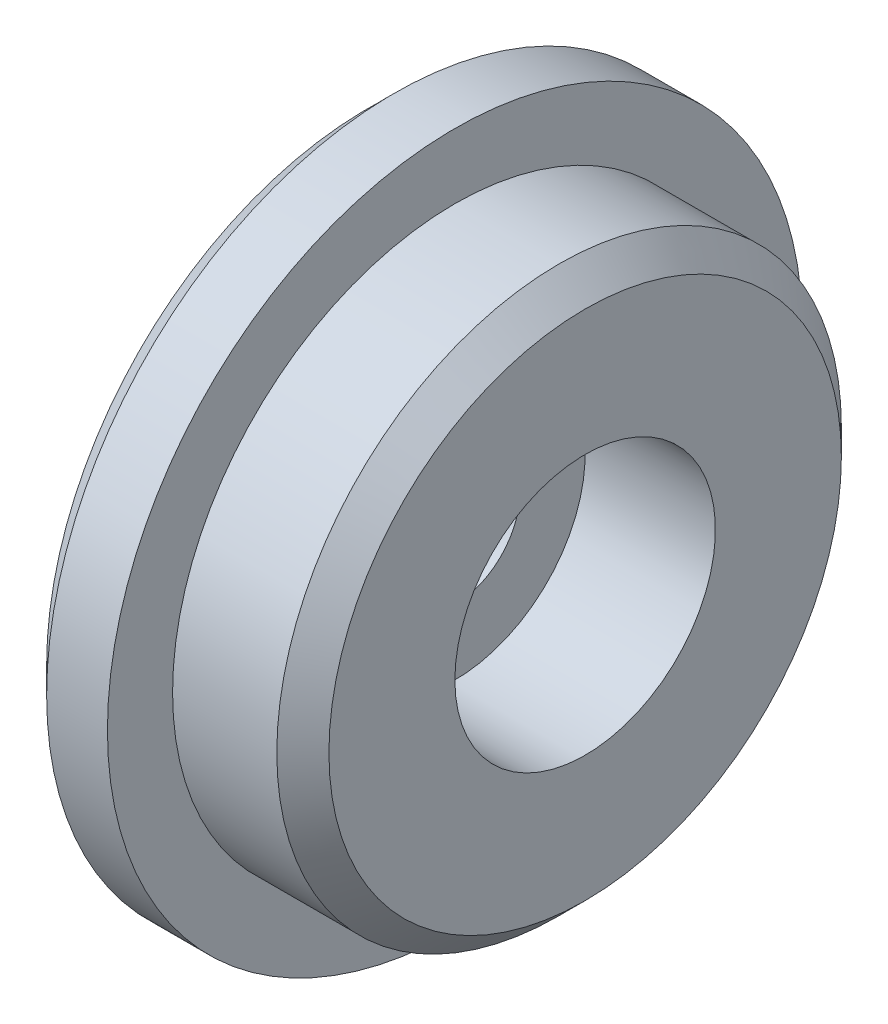
ISO-10303-21;
HEADER;
FILE_DESCRIPTION(('STEP AP214'),'2;1');
FILE_NAME('part.step','',(''),(''),'','','');
FILE_SCHEMA(('AUTOMOTIVE_DESIGN { 1 0 10303 214 1 1 1 1 }'));
ENDSEC;
DATA;
#1=APPLICATION_CONTEXT('core data for automotive mechanical design processes');
#2=APPLICATION_PROTOCOL_DEFINITION('international standard','automotive_design',2000,#1);
#3=PRODUCT_CONTEXT('',#1,'mechanical');
#4=PRODUCT('Part','Part','',(#3));
#5=PRODUCT_RELATED_PRODUCT_CATEGORY('part','',(#4));
#6=PRODUCT_DEFINITION_FORMATION('','',#4);
#7=PRODUCT_DEFINITION_CONTEXT('part definition',#1,'design');
#8=PRODUCT_DEFINITION('design','',#6,#7);
#9=PRODUCT_DEFINITION_SHAPE('','',#8);
#10=(LENGTH_UNIT() NAMED_UNIT(*) SI_UNIT(.MILLI.,.METRE.));
#11=(NAMED_UNIT(*) PLANE_ANGLE_UNIT() SI_UNIT($,.RADIAN.));
#12=(NAMED_UNIT(*) SI_UNIT($,.STERADIAN.) SOLID_ANGLE_UNIT());
#13=UNCERTAINTY_MEASURE_WITH_UNIT(LENGTH_MEASURE(1.E-05),#10,'distance_accuracy_value','');
#14=(GEOMETRIC_REPRESENTATION_CONTEXT(3) GLOBAL_UNCERTAINTY_ASSIGNED_CONTEXT((#13)) GLOBAL_UNIT_ASSIGNED_CONTEXT((#10,
#11,#12)) REPRESENTATION_CONTEXT('',''));
#15=CARTESIAN_POINT('',(0.,0.,0.));
#16=DIRECTION('',(0.,0.,1.));
#17=DIRECTION('',(1.,0.,0.));
#18=AXIS2_PLACEMENT_3D('',#15,#16,#17);
#19=CARTESIAN_POINT('',(0.,0.,0.));
#20=DIRECTION('',(-1.,0.,0.));
#21=DIRECTION('',(0.,0.,1.));
#22=AXIS2_PLACEMENT_3D('',#19,#20,#21);
#23=CYLINDRICAL_SURFACE('',#22,4.7625);
#24=CARTESIAN_POINT('',(-0.600085910652921,0.,0.));
#25=DIRECTION('',(-1.,0.,0.));
#26=DIRECTION('',(0.,0.,1.));
#27=AXIS2_PLACEMENT_3D('',#24,#25,#26);
#28=CIRCLE('',#27,4.7625);
#29=CARTESIAN_POINT('',(-0.600085910652921,0.,4.7625));
#30=VERTEX_POINT('',#29);
#31=EDGE_CURVE('E54',#30,#30,#28,.T.);
#32=ORIENTED_EDGE('',*,*,#31,.T.);
#33=EDGE_LOOP('',(#32));
#34=FACE_BOUND('',#33,.T.);
#35=CARTESIAN_POINT('',(5.74991408934708,0.,0.));
#36=DIRECTION('',(-1.,0.,0.));
#37=DIRECTION('',(0.,0.,1.));
#38=AXIS2_PLACEMENT_3D('',#35,#36,#37);
#39=CIRCLE('',#38,4.7625);
#40=CARTESIAN_POINT('',(5.74991408934708,0.,4.7625));
#41=VERTEX_POINT('',#40);
#42=EDGE_CURVE('E69',#41,#41,#39,.T.);
#43=ORIENTED_EDGE('',*,*,#42,.F.);
#44=EDGE_LOOP('',(#43));
#45=FACE_BOUND('',#44,.T.);
#46=ADVANCED_FACE('F33',(#34,#45),#23,.F.);
#47=CARTESIAN_POINT('',(-0.60008591065292,-4.7625,0.));
#48=DIRECTION('',(-1.,0.,0.));
#49=DIRECTION('',(0.,0.,1.));
#50=AXIS2_PLACEMENT_3D('',#47,#48,#49);
#51=PLANE('',#50);
#52=CARTESIAN_POINT('',(-0.60008591065292,0.,0.));
#53=DIRECTION('',(-1.,0.,0.));
#54=DIRECTION('',(0.,0.,1.));
#55=AXIS2_PLACEMENT_3D('',#52,#53,#54);
#56=CIRCLE('',#55,23.495);
#57=CARTESIAN_POINT('',(-0.60008591065292,0.,23.495));
#58=VERTEX_POINT('',#57);
#59=EDGE_CURVE('E49',#58,#58,#56,.T.);
#60=ORIENTED_EDGE('',*,*,#59,.T.);
#61=EDGE_LOOP('',(#60));
#62=FACE_BOUND('',#61,.T.);
#63=ORIENTED_EDGE('',*,*,#31,.F.);
#64=EDGE_LOOP('',(#63));
#65=FACE_BOUND('',#64,.T.);
#66=ADVANCED_FACE('F77',(#62,#65),#51,.T.);
#67=CARTESIAN_POINT('',(0.,0.,0.));
#68=DIRECTION('',(-1.,0.,0.));
#69=DIRECTION('',(0.,0.,1.));
#70=AXIS2_PLACEMENT_3D('',#67,#68,#69);
#71=CYLINDRICAL_SURFACE('',#70,25.4);
#72=CARTESIAN_POINT('',(1.30491408934709,0.,0.));
#73=DIRECTION('',(-1.,0.,0.));
#74=DIRECTION('',(0.,0.,1.));
#75=AXIS2_PLACEMENT_3D('',#72,#73,#74);
#76=CIRCLE('',#75,25.4);
#77=CARTESIAN_POINT('',(1.30491408934709,0.,25.4));
#78=VERTEX_POINT('',#77);
#79=EDGE_CURVE('E45',#78,#78,#76,.F.);
#80=ORIENTED_EDGE('',*,*,#79,.T.);
#81=EDGE_LOOP('',(#80));
#82=FACE_BOUND('',#81,.T.);
#83=CARTESIAN_POINT('',(5.74991408934708,0.,0.));
#84=DIRECTION('',(-1.,0.,0.));
#85=DIRECTION('',(0.,0.,1.));
#86=AXIS2_PLACEMENT_3D('',#83,#84,#85);
#87=CIRCLE('',#86,25.4);
#88=CARTESIAN_POINT('',(5.74991408934708,0.,25.4));
#89=VERTEX_POINT('',#88);
#90=EDGE_CURVE('E57',#89,#89,#87,.T.);
#91=ORIENTED_EDGE('',*,*,#90,.T.);
#92=EDGE_LOOP('',(#91));
#93=FACE_BOUND('',#92,.T.);
#94=ADVANCED_FACE('F83',(#82,#93),#71,.T.);
#95=CARTESIAN_POINT('',(5.74991408934708,-25.4,0.));
#96=DIRECTION('',(1.,0.,0.));
#97=DIRECTION('',(0.,0.,-1.));
#98=AXIS2_PLACEMENT_3D('',#95,#96,#97);
#99=PLANE('',#98);
#100=CARTESIAN_POINT('',(5.74991408934708,0.,0.));
#101=DIRECTION('',(-1.,0.,0.));
#102=DIRECTION('',(0.,0.,1.));
#103=AXIS2_PLACEMENT_3D('',#100,#101,#102);
#104=CIRCLE('',#103,20.6375);
#105=CARTESIAN_POINT('',(5.74991408934708,0.,20.6375));
#106=VERTEX_POINT('',#105);
#107=EDGE_CURVE('E60',#106,#106,#104,.T.);
#108=ORIENTED_EDGE('',*,*,#107,.T.);
#109=EDGE_LOOP('',(#108));
#110=FACE_BOUND('',#109,.T.);
#111=ORIENTED_EDGE('',*,*,#90,.F.);
#112=EDGE_LOOP('',(#111));
#113=FACE_BOUND('',#112,.T.);
#114=ADVANCED_FACE('F108',(#110,#113),#99,.T.);
#115=CARTESIAN_POINT('',(0.,0.,0.));
#116=DIRECTION('',(-1.,0.,0.));
#117=DIRECTION('',(0.,0.,1.));
#118=AXIS2_PLACEMENT_3D('',#115,#116,#117);
#119=CYLINDRICAL_SURFACE('',#118,20.6375);
#120=CARTESIAN_POINT('',(13.3699140893471,0.,0.));
#121=DIRECTION('',(1.,0.,0.));
#122=DIRECTION('',(0.,0.,-1.));
#123=AXIS2_PLACEMENT_3D('',#120,#121,#122);
#124=CIRCLE('',#123,20.6375);
#125=CARTESIAN_POINT('',(13.3699140893471,0.,-20.6375));
#126=VERTEX_POINT('',#125);
#127=EDGE_CURVE('E41',#126,#126,#124,.F.);
#128=ORIENTED_EDGE('',*,*,#127,.T.);
#129=EDGE_LOOP('',(#128));
#130=FACE_BOUND('',#129,.T.);
#131=ORIENTED_EDGE('',*,*,#107,.F.);
#132=EDGE_LOOP('',(#131));
#133=FACE_BOUND('',#132,.T.);
#134=ADVANCED_FACE('F112',(#130,#133),#119,.T.);
#135=CARTESIAN_POINT('',(15.2749140893471,-20.6375,0.));
#136=DIRECTION('',(1.,0.,0.));
#137=DIRECTION('',(0.,0.,-1.));
#138=AXIS2_PLACEMENT_3D('',#135,#136,#137);
#139=PLANE('',#138);
#140=CARTESIAN_POINT('',(15.2749140893471,0.,0.));
#141=DIRECTION('',(1.,0.,0.));
#142=DIRECTION('',(0.,0.,-1.));
#143=AXIS2_PLACEMENT_3D('',#140,#141,#142);
#144=CIRCLE('',#143,18.7325);
#145=CARTESIAN_POINT('',(15.2749140893471,0.,-18.7325));
#146=VERTEX_POINT('',#145);
#147=EDGE_CURVE('E10',#146,#146,#144,.T.);
#148=ORIENTED_EDGE('',*,*,#147,.T.);
#149=EDGE_LOOP('',(#148));
#150=FACE_BOUND('',#149,.T.);
#151=CARTESIAN_POINT('',(15.2749140893471,0.,0.));
#152=DIRECTION('',(-1.,0.,0.));
#153=DIRECTION('',(0.,0.,1.));
#154=AXIS2_PLACEMENT_3D('',#151,#152,#153);
#155=CIRCLE('',#154,9.525);
#156=CARTESIAN_POINT('',(15.2749140893471,0.,9.525));
#157=VERTEX_POINT('',#156);
#158=EDGE_CURVE('E63',#157,#157,#155,.T.);
#159=ORIENTED_EDGE('',*,*,#158,.T.);
#160=EDGE_LOOP('',(#159));
#161=FACE_BOUND('',#160,.T.);
#162=ADVANCED_FACE('F118',(#150,#161),#139,.T.);
#163=CARTESIAN_POINT('',(0.,0.,0.));
#164=DIRECTION('',(-1.,0.,0.));
#165=DIRECTION('',(0.,0.,1.));
#166=AXIS2_PLACEMENT_3D('',#163,#164,#165);
#167=CYLINDRICAL_SURFACE('',#166,9.525);
#168=CARTESIAN_POINT('',(5.74991408934708,0.,0.));
#169=DIRECTION('',(-1.,0.,0.));
#170=DIRECTION('',(0.,0.,1.));
#171=AXIS2_PLACEMENT_3D('',#168,#169,#170);
#172=CIRCLE('',#171,9.525);
#173=CARTESIAN_POINT('',(5.74991408934708,0.,9.525));
#174=VERTEX_POINT('',#173);
#175=EDGE_CURVE('E66',#174,#174,#172,.T.);
#176=ORIENTED_EDGE('',*,*,#175,.T.);
#177=EDGE_LOOP('',(#176));
#178=FACE_BOUND('',#177,.T.);
#179=ORIENTED_EDGE('',*,*,#158,.F.);
#180=EDGE_LOOP('',(#179));
#181=FACE_BOUND('',#180,.T.);
#182=ADVANCED_FACE('F98',(#178,#181),#167,.F.);
#183=CARTESIAN_POINT('',(5.74991408934708,-9.525,0.));
#184=DIRECTION('',(1.,0.,0.));
#185=DIRECTION('',(0.,0.,-1.));
#186=AXIS2_PLACEMENT_3D('',#183,#184,#185);
#187=PLANE('',#186);
#188=ORIENTED_EDGE('',*,*,#42,.T.);
#189=EDGE_LOOP('',(#188));
#190=FACE_BOUND('',#189,.T.);
#191=ORIENTED_EDGE('',*,*,#175,.F.);
#192=EDGE_LOOP('',(#191));
#193=FACE_BOUND('',#192,.T.);
#194=ADVANCED_FACE('F73',(#190,#193),#187,.T.);
#195=CARTESIAN_POINT('',(-0.60008591065292,0.,0.));
#196=DIRECTION('',(1.,0.,0.));
#197=DIRECTION('',(0.,0.,-1.));
#198=AXIS2_PLACEMENT_3D('',#195,#196,#197);
#199=CONICAL_SURFACE('',#198,23.495,0.785398163397446);
#200=ORIENTED_EDGE('',*,*,#79,.F.);
#201=EDGE_LOOP('',(#200));
#202=FACE_BOUND('',#201,.T.);
#203=ORIENTED_EDGE('',*,*,#59,.F.);
#204=EDGE_LOOP('',(#203));
#205=FACE_BOUND('',#204,.T.);
#206=ADVANCED_FACE('F88',(#202,#205),#199,.T.);
#207=CARTESIAN_POINT('',(13.3699140893471,0.,0.));
#208=DIRECTION('',(-1.,0.,0.));
#209=DIRECTION('',(0.,0.,1.));
#210=AXIS2_PLACEMENT_3D('',#207,#208,#209);
#211=CONICAL_SURFACE('',#210,20.6375,0.78539816339745);
#212=ORIENTED_EDGE('',*,*,#147,.F.);
#213=EDGE_LOOP('',(#212));
#214=FACE_BOUND('',#213,.T.);
#215=ORIENTED_EDGE('',*,*,#127,.F.);
#216=EDGE_LOOP('',(#215));
#217=FACE_BOUND('',#216,.T.);
#218=ADVANCED_FACE('F36',(#214,#217),#211,.T.);
#219=CLOSED_SHELL('',(#46,#66,#94,#114,#134,#162,#182,#194,#206,#218));
#220=MANIFOLD_SOLID_BREP('B2',#219);
#221=ADVANCED_BREP_SHAPE_REPRESENTATION('',(#18,#220),#14);
#222=SHAPE_DEFINITION_REPRESENTATION(#9,#221);
ENDSEC;
END-ISO-10303-21;
